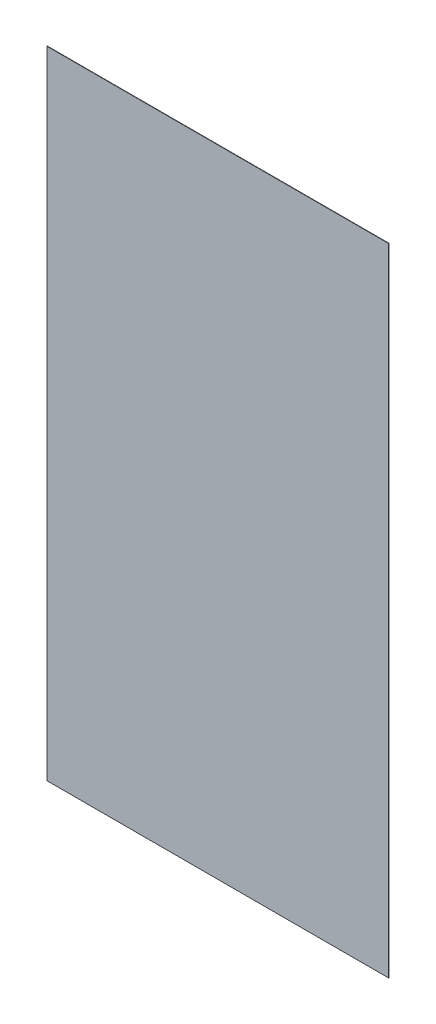
ISO-10303-21;
HEADER;
FILE_DESCRIPTION(('STEP AP214'),'2;1');
FILE_NAME('part.step','',(''),(''),'','','');
FILE_SCHEMA(('AUTOMOTIVE_DESIGN { 1 0 10303 214 1 1 1 1 }'));
ENDSEC;
DATA;
#1=APPLICATION_CONTEXT('core data for automotive mechanical design processes');
#2=APPLICATION_PROTOCOL_DEFINITION('international standard','automotive_design',2000,#1);
#3=PRODUCT_CONTEXT('',#1,'mechanical');
#4=PRODUCT('Part','Part','',(#3));
#5=PRODUCT_RELATED_PRODUCT_CATEGORY('part','',(#4));
#6=PRODUCT_DEFINITION_FORMATION('','',#4);
#7=PRODUCT_DEFINITION_CONTEXT('part definition',#1,'design');
#8=PRODUCT_DEFINITION('design','',#6,#7);
#9=PRODUCT_DEFINITION_SHAPE('','',#8);
#10=(LENGTH_UNIT() NAMED_UNIT(*) SI_UNIT(.MILLI.,.METRE.));
#11=(NAMED_UNIT(*) PLANE_ANGLE_UNIT() SI_UNIT($,.RADIAN.));
#12=(NAMED_UNIT(*) SI_UNIT($,.STERADIAN.) SOLID_ANGLE_UNIT());
#13=UNCERTAINTY_MEASURE_WITH_UNIT(LENGTH_MEASURE(1.E-05),#10,'distance_accuracy_value','');
#14=(GEOMETRIC_REPRESENTATION_CONTEXT(3) GLOBAL_UNCERTAINTY_ASSIGNED_CONTEXT((#13)) GLOBAL_UNIT_ASSIGNED_CONTEXT((#10,
#11,#12)) REPRESENTATION_CONTEXT('',''));
#15=CARTESIAN_POINT('',(0.,0.,0.));
#16=DIRECTION('',(0.,0.,1.));
#17=DIRECTION('',(1.,0.,0.));
#18=AXIS2_PLACEMENT_3D('',#15,#16,#17);
#19=CARTESIAN_POINT('',(0.,0.,1.));
#20=DIRECTION('',(1.,0.,0.));
#21=DIRECTION('',(0.,1.,0.));
#22=AXIS2_PLACEMENT_3D('',#19,#20,#21);
#23=PLANE('',#22);
#24=DIRECTION('',(0.,-1.,0.));
#25=VECTOR('',#24,1.);
#26=CARTESIAN_POINT('',(0.,0.,0.));
#27=LINE('',#26,#25);
#28=CARTESIAN_POINT('',(-4.44089209850063E-13,1625.,0.));
#29=VERTEX_POINT('',#28);
#30=CARTESIAN_POINT('',(0.,0.,0.));
#31=VERTEX_POINT('',#30);
#32=EDGE_CURVE('E107',#29,#31,#27,.T.);
#33=ORIENTED_EDGE('',*,*,#32,.T.);
#34=DIRECTION('',(0.,0.,-1.));
#35=VECTOR('',#34,1.);
#36=CARTESIAN_POINT('',(0.,0.,1.));
#37=LINE('',#36,#35);
#38=CARTESIAN_POINT('',(0.,0.,1.));
#39=VERTEX_POINT('',#38);
#40=EDGE_CURVE('E11',#39,#31,#37,.T.);
#41=ORIENTED_EDGE('',*,*,#40,.F.);
#42=DIRECTION('',(0.,-1.,0.));
#43=VECTOR('',#42,1.);
#44=CARTESIAN_POINT('',(0.,0.,1.));
#45=LINE('',#44,#43);
#46=CARTESIAN_POINT('',(-4.44089209850063E-13,1625.,1.));
#47=VERTEX_POINT('',#46);
#48=EDGE_CURVE('E91',#47,#39,#45,.T.);
#49=ORIENTED_EDGE('',*,*,#48,.F.);
#50=DIRECTION('',(0.,0.,-1.));
#51=VECTOR('',#50,1.);
#52=CARTESIAN_POINT('',(-4.44089209850063E-13,1625.,1.));
#53=LINE('',#52,#51);
#54=EDGE_CURVE('E103',#47,#29,#53,.T.);
#55=ORIENTED_EDGE('',*,*,#54,.T.);
#56=EDGE_LOOP('',(#33,#41,#49,#55));
#57=FACE_BOUND('',#56,.T.);
#58=ADVANCED_FACE('F39',(#57),#23,.F.);
#59=CARTESIAN_POINT('',(0.,0.,1.));
#60=DIRECTION('',(0.,1.,0.));
#61=DIRECTION('',(0.,0.,1.));
#62=AXIS2_PLACEMENT_3D('',#59,#60,#61);
#63=PLANE('',#62);
#64=DIRECTION('',(1.,0.,0.));
#65=VECTOR('',#64,1.);
#66=CARTESIAN_POINT('',(0.,0.,0.));
#67=LINE('',#66,#65);
#68=CARTESIAN_POINT('',(873.,0.,0.));
#69=VERTEX_POINT('',#68);
#70=EDGE_CURVE('E96',#31,#69,#67,.T.);
#71=ORIENTED_EDGE('',*,*,#70,.T.);
#72=DIRECTION('',(0.,0.,-1.));
#73=VECTOR('',#72,1.);
#74=CARTESIAN_POINT('',(873.,0.,1.));
#75=LINE('',#74,#73);
#76=CARTESIAN_POINT('',(873.,0.,1.));
#77=VERTEX_POINT('',#76);
#78=EDGE_CURVE('E48',#77,#69,#75,.T.);
#79=ORIENTED_EDGE('',*,*,#78,.F.);
#80=DIRECTION('',(1.,0.,0.));
#81=VECTOR('',#80,1.);
#82=CARTESIAN_POINT('',(0.,0.,1.));
#83=LINE('',#82,#81);
#84=EDGE_CURVE('E86',#39,#77,#83,.T.);
#85=ORIENTED_EDGE('',*,*,#84,.F.);
#86=ORIENTED_EDGE('',*,*,#40,.T.);
#87=EDGE_LOOP('',(#71,#79,#85,#86));
#88=FACE_BOUND('',#87,.T.);
#89=ADVANCED_FACE('F95',(#88),#63,.F.);
#90=CARTESIAN_POINT('',(873.,0.,1.));
#91=DIRECTION('',(-1.,0.,0.));
#92=DIRECTION('',(0.,-1.,0.));
#93=AXIS2_PLACEMENT_3D('',#90,#91,#92);
#94=PLANE('',#93);
#95=DIRECTION('',(0.,1.,0.));
#96=VECTOR('',#95,1.);
#97=CARTESIAN_POINT('',(873.,0.,0.));
#98=LINE('',#97,#96);
#99=CARTESIAN_POINT('',(873.,1625.,0.));
#100=VERTEX_POINT('',#99);
#101=EDGE_CURVE('E73',#69,#100,#98,.T.);
#102=ORIENTED_EDGE('',*,*,#101,.T.);
#103=DIRECTION('',(0.,0.,-1.));
#104=VECTOR('',#103,1.);
#105=CARTESIAN_POINT('',(873.,1625.,1.));
#106=LINE('',#105,#104);
#107=CARTESIAN_POINT('',(873.,1625.,1.));
#108=VERTEX_POINT('',#107);
#109=EDGE_CURVE('E98',#108,#100,#106,.T.);
#110=ORIENTED_EDGE('',*,*,#109,.F.);
#111=DIRECTION('',(0.,1.,0.));
#112=VECTOR('',#111,1.);
#113=CARTESIAN_POINT('',(873.,0.,1.));
#114=LINE('',#113,#112);
#115=EDGE_CURVE('E89',#77,#108,#114,.T.);
#116=ORIENTED_EDGE('',*,*,#115,.F.);
#117=ORIENTED_EDGE('',*,*,#78,.T.);
#118=EDGE_LOOP('',(#102,#110,#116,#117));
#119=FACE_BOUND('',#118,.T.);
#120=ADVANCED_FACE('F99',(#119),#94,.F.);
#121=CARTESIAN_POINT('',(-4.44089209850063E-13,1625.,1.));
#122=DIRECTION('',(0.,-1.,0.));
#123=DIRECTION('',(0.,0.,-1.));
#124=AXIS2_PLACEMENT_3D('',#121,#122,#123);
#125=PLANE('',#124);
#126=DIRECTION('',(-1.,0.,0.));
#127=VECTOR('',#126,1.);
#128=CARTESIAN_POINT('',(-4.44089209850063E-13,1625.,0.));
#129=LINE('',#128,#127);
#130=EDGE_CURVE('E79',#100,#29,#129,.T.);
#131=ORIENTED_EDGE('',*,*,#130,.T.);
#132=ORIENTED_EDGE('',*,*,#54,.F.);
#133=DIRECTION('',(-1.,0.,0.));
#134=VECTOR('',#133,1.);
#135=CARTESIAN_POINT('',(-4.44089209850063E-13,1625.,1.));
#136=LINE('',#135,#134);
#137=EDGE_CURVE('E56',#108,#47,#136,.T.);
#138=ORIENTED_EDGE('',*,*,#137,.F.);
#139=ORIENTED_EDGE('',*,*,#109,.T.);
#140=EDGE_LOOP('',(#131,#132,#138,#139));
#141=FACE_BOUND('',#140,.T.);
#142=ADVANCED_FACE('F120',(#141),#125,.F.);
#143=CARTESIAN_POINT('',(0.,0.,1.));
#144=DIRECTION('',(0.,0.,-1.));
#145=DIRECTION('',(-1.,0.,0.));
#146=AXIS2_PLACEMENT_3D('',#143,#144,#145);
#147=PLANE('',#146);
#148=ORIENTED_EDGE('',*,*,#48,.T.);
#149=ORIENTED_EDGE('',*,*,#84,.T.);
#150=ORIENTED_EDGE('',*,*,#115,.T.);
#151=ORIENTED_EDGE('',*,*,#137,.T.);
#152=EDGE_LOOP('',(#148,#149,#150,#151));
#153=FACE_BOUND('',#152,.T.);
#154=ADVANCED_FACE('F87',(#153),#147,.F.);
#155=CARTESIAN_POINT('',(0.,0.,0.));
#156=DIRECTION('',(0.,0.,-1.));
#157=DIRECTION('',(-1.,0.,0.));
#158=AXIS2_PLACEMENT_3D('',#155,#156,#157);
#159=PLANE('',#158);
#160=ORIENTED_EDGE('',*,*,#32,.F.);
#161=ORIENTED_EDGE('',*,*,#130,.F.);
#162=ORIENTED_EDGE('',*,*,#101,.F.);
#163=ORIENTED_EDGE('',*,*,#70,.F.);
#164=EDGE_LOOP('',(#160,#161,#162,#163));
#165=FACE_BOUND('',#164,.T.);
#166=ADVANCED_FACE('F123',(#165),#159,.T.);
#167=CLOSED_SHELL('',(#58,#89,#120,#142,#154,#166));
#168=MANIFOLD_SOLID_BREP('B2',#167);
#169=ADVANCED_BREP_SHAPE_REPRESENTATION('',(#18,#168),#14);
#170=SHAPE_DEFINITION_REPRESENTATION(#9,#169);
ENDSEC;
END-ISO-10303-21;
